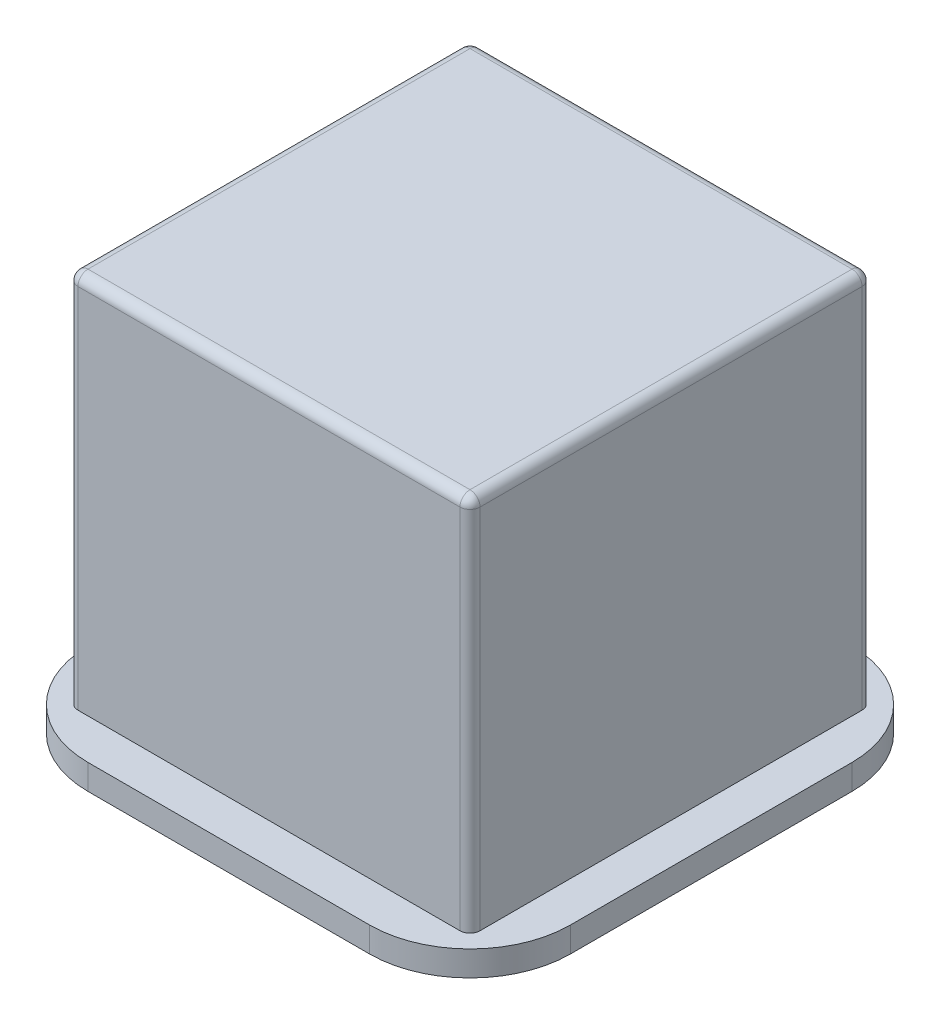
ISO-10303-21;
HEADER;
FILE_DESCRIPTION(('STEP AP214'),'2;1');
FILE_NAME('part.step','',(''),(''),'','','');
FILE_SCHEMA(('AUTOMOTIVE_DESIGN { 1 0 10303 214 1 1 1 1 }'));
ENDSEC;
DATA;
#1=APPLICATION_CONTEXT('core data for automotive mechanical design processes');
#2=APPLICATION_PROTOCOL_DEFINITION('international standard','automotive_design',2000,#1);
#3=PRODUCT_CONTEXT('',#1,'mechanical');
#4=PRODUCT('Part','Part','',(#3));
#5=PRODUCT_RELATED_PRODUCT_CATEGORY('part','',(#4));
#6=PRODUCT_DEFINITION_FORMATION('','',#4);
#7=PRODUCT_DEFINITION_CONTEXT('part definition',#1,'design');
#8=PRODUCT_DEFINITION('design','',#6,#7);
#9=PRODUCT_DEFINITION_SHAPE('','',#8);
#10=(LENGTH_UNIT() NAMED_UNIT(*) SI_UNIT(.MILLI.,.METRE.));
#11=(NAMED_UNIT(*) PLANE_ANGLE_UNIT() SI_UNIT($,.RADIAN.));
#12=(NAMED_UNIT(*) SI_UNIT($,.STERADIAN.) SOLID_ANGLE_UNIT());
#13=UNCERTAINTY_MEASURE_WITH_UNIT(LENGTH_MEASURE(1.E-05),#10,'distance_accuracy_value','');
#14=(GEOMETRIC_REPRESENTATION_CONTEXT(3) GLOBAL_UNCERTAINTY_ASSIGNED_CONTEXT((#13)) GLOBAL_UNIT_ASSIGNED_CONTEXT((#10,
#11,#12)) REPRESENTATION_CONTEXT('',''));
#15=CARTESIAN_POINT('',(0.,0.,0.));
#16=DIRECTION('',(0.,0.,1.));
#17=DIRECTION('',(1.,0.,0.));
#18=AXIS2_PLACEMENT_3D('',#15,#16,#17);
#19=CARTESIAN_POINT('',(0.,200.,0.));
#20=DIRECTION('',(1.,0.,0.));
#21=DIRECTION('',(0.,0.,-1.));
#22=AXIS2_PLACEMENT_3D('',#19,#20,#21);
#23=PLANE('',#22);
#24=DIRECTION('',(0.,0.,1.));
#25=VECTOR('',#24,1.);
#26=CARTESIAN_POINT('',(0.,195.,0.));
#27=LINE('',#26,#25);
#28=CARTESIAN_POINT('',(0.,195.,-5.));
#29=VERTEX_POINT('',#28);
#30=CARTESIAN_POINT('',(0.,195.,-195.));
#31=VERTEX_POINT('',#30);
#32=EDGE_CURVE('E50',#29,#31,#27,.F.);
#33=ORIENTED_EDGE('',*,*,#32,.T.);
#34=DIRECTION('',(0.,-1.,0.));
#35=VECTOR('',#34,1.);
#36=CARTESIAN_POINT('',(0.,200.,-195.));
#37=LINE('',#36,#35);
#38=CARTESIAN_POINT('',(0.,12.5,-195.));
#39=VERTEX_POINT('',#38);
#40=EDGE_CURVE('E260',#31,#39,#37,.T.);
#41=ORIENTED_EDGE('',*,*,#40,.T.);
#42=DIRECTION('',(0.,0.,-1.));
#43=VECTOR('',#42,1.);
#44=CARTESIAN_POINT('',(0.,12.5,-220.));
#45=LINE('',#44,#43);
#46=CARTESIAN_POINT('',(0.,12.5,-5.));
#47=VERTEX_POINT('',#46);
#48=EDGE_CURVE('E202',#47,#39,#45,.T.);
#49=ORIENTED_EDGE('',*,*,#48,.F.);
#50=DIRECTION('',(0.,-1.,0.));
#51=VECTOR('',#50,1.);
#52=CARTESIAN_POINT('',(0.,200.,-5.));
#53=LINE('',#52,#51);
#54=EDGE_CURVE('E55',#47,#29,#53,.F.);
#55=ORIENTED_EDGE('',*,*,#54,.T.);
#56=EDGE_LOOP('',(#33,#41,#49,#55));
#57=FACE_BOUND('',#56,.T.);
#58=ADVANCED_FACE('F33',(#57),#23,.F.);
#59=CARTESIAN_POINT('',(0.,200.,-200.));
#60=DIRECTION('',(0.,0.,1.));
#61=DIRECTION('',(1.,0.,0.));
#62=AXIS2_PLACEMENT_3D('',#59,#60,#61);
#63=PLANE('',#62);
#64=DIRECTION('',(-1.,0.,0.));
#65=VECTOR('',#64,1.);
#66=CARTESIAN_POINT('',(0.,195.,-200.));
#67=LINE('',#66,#65);
#68=CARTESIAN_POINT('',(5.,195.,-200.));
#69=VERTEX_POINT('',#68);
#70=CARTESIAN_POINT('',(195.,195.,-200.));
#71=VERTEX_POINT('',#70);
#72=EDGE_CURVE('E232',#69,#71,#67,.F.);
#73=ORIENTED_EDGE('',*,*,#72,.T.);
#74=DIRECTION('',(0.,-1.,0.));
#75=VECTOR('',#74,1.);
#76=CARTESIAN_POINT('',(195.,200.,-200.));
#77=LINE('',#76,#75);
#78=CARTESIAN_POINT('',(195.,12.5,-200.));
#79=VERTEX_POINT('',#78);
#80=EDGE_CURVE('E234',#71,#79,#77,.T.);
#81=ORIENTED_EDGE('',*,*,#80,.T.);
#82=DIRECTION('',(1.,0.,0.));
#83=VECTOR('',#82,1.);
#84=CARTESIAN_POINT('',(220.,12.5,-200.));
#85=LINE('',#84,#83);
#86=CARTESIAN_POINT('',(5.,12.5,-200.));
#87=VERTEX_POINT('',#86);
#88=EDGE_CURVE('E194',#87,#79,#85,.T.);
#89=ORIENTED_EDGE('',*,*,#88,.F.);
#90=DIRECTION('',(0.,-1.,0.));
#91=VECTOR('',#90,1.);
#92=CARTESIAN_POINT('',(5.,200.,-200.));
#93=LINE('',#92,#91);
#94=EDGE_CURVE('E230',#87,#69,#93,.F.);
#95=ORIENTED_EDGE('',*,*,#94,.T.);
#96=EDGE_LOOP('',(#73,#81,#89,#95));
#97=FACE_BOUND('',#96,.T.);
#98=ADVANCED_FACE('F351',(#97),#63,.F.);
#99=CARTESIAN_POINT('',(200.,200.,0.));
#100=DIRECTION('',(-1.,0.,0.));
#101=DIRECTION('',(0.,0.,1.));
#102=AXIS2_PLACEMENT_3D('',#99,#100,#101);
#103=PLANE('',#102);
#104=DIRECTION('',(0.,0.,1.));
#105=VECTOR('',#104,1.);
#106=CARTESIAN_POINT('',(200.,12.5,20.));
#107=LINE('',#106,#105);
#108=CARTESIAN_POINT('',(200.,12.5,-195.));
#109=VERTEX_POINT('',#108);
#110=CARTESIAN_POINT('',(200.,12.5,-5.));
#111=VERTEX_POINT('',#110);
#112=EDGE_CURVE('E186',#109,#111,#107,.T.);
#113=ORIENTED_EDGE('',*,*,#112,.F.);
#114=DIRECTION('',(0.,-1.,0.));
#115=VECTOR('',#114,1.);
#116=CARTESIAN_POINT('',(200.,200.,-195.));
#117=LINE('',#116,#115);
#118=CARTESIAN_POINT('',(200.,195.,-195.));
#119=VERTEX_POINT('',#118);
#120=EDGE_CURVE('E241',#109,#119,#117,.F.);
#121=ORIENTED_EDGE('',*,*,#120,.T.);
#122=DIRECTION('',(0.,0.,-1.));
#123=VECTOR('',#122,1.);
#124=CARTESIAN_POINT('',(200.,195.,0.));
#125=LINE('',#124,#123);
#126=CARTESIAN_POINT('',(200.,195.,-5.));
#127=VERTEX_POINT('',#126);
#128=EDGE_CURVE('E237',#119,#127,#125,.F.);
#129=ORIENTED_EDGE('',*,*,#128,.T.);
#130=DIRECTION('',(0.,-1.,0.));
#131=VECTOR('',#130,1.);
#132=CARTESIAN_POINT('',(200.,200.,-5.));
#133=LINE('',#132,#131);
#134=EDGE_CURVE('E239',#127,#111,#133,.T.);
#135=ORIENTED_EDGE('',*,*,#134,.T.);
#136=EDGE_LOOP('',(#113,#121,#129,#135));
#137=FACE_BOUND('',#136,.T.);
#138=ADVANCED_FACE('F356',(#137),#103,.F.);
#139=CARTESIAN_POINT('',(0.,200.,0.));
#140=DIRECTION('',(0.,0.,-1.));
#141=DIRECTION('',(-1.,0.,0.));
#142=AXIS2_PLACEMENT_3D('',#139,#140,#141);
#143=PLANE('',#142);
#144=DIRECTION('',(-1.,0.,0.));
#145=VECTOR('',#144,1.);
#146=CARTESIAN_POINT('',(0.,12.5,0.));
#147=LINE('',#146,#145);
#148=CARTESIAN_POINT('',(195.,12.5,0.));
#149=VERTEX_POINT('',#148);
#150=CARTESIAN_POINT('',(5.,12.5,0.));
#151=VERTEX_POINT('',#150);
#152=EDGE_CURVE('E188',#149,#151,#147,.T.);
#153=ORIENTED_EDGE('',*,*,#152,.F.);
#154=DIRECTION('',(0.,-1.,0.));
#155=VECTOR('',#154,1.);
#156=CARTESIAN_POINT('',(195.,200.,0.));
#157=LINE('',#156,#155);
#158=CARTESIAN_POINT('',(195.,195.,0.));
#159=VERTEX_POINT('',#158);
#160=EDGE_CURVE('E247',#149,#159,#157,.F.);
#161=ORIENTED_EDGE('',*,*,#160,.T.);
#162=DIRECTION('',(1.,0.,0.));
#163=VECTOR('',#162,1.);
#164=CARTESIAN_POINT('',(0.,195.,0.));
#165=LINE('',#164,#163);
#166=CARTESIAN_POINT('',(5.,195.,0.));
#167=VERTEX_POINT('',#166);
#168=EDGE_CURVE('E245',#159,#167,#165,.F.);
#169=ORIENTED_EDGE('',*,*,#168,.T.);
#170=DIRECTION('',(0.,-1.,0.));
#171=VECTOR('',#170,1.);
#172=CARTESIAN_POINT('',(5.,200.,0.));
#173=LINE('',#172,#171);
#174=EDGE_CURVE('E243',#167,#151,#173,.T.);
#175=ORIENTED_EDGE('',*,*,#174,.T.);
#176=EDGE_LOOP('',(#153,#161,#169,#175));
#177=FACE_BOUND('',#176,.T.);
#178=ADVANCED_FACE('F360',(#177),#143,.F.);
#179=CARTESIAN_POINT('',(0.,200.,0.));
#180=DIRECTION('',(0.,-1.,0.));
#181=DIRECTION('',(0.,0.,-1.));
#182=AXIS2_PLACEMENT_3D('',#179,#180,#181);
#183=PLANE('',#182);
#184=DIRECTION('',(0.,0.,-1.));
#185=VECTOR('',#184,1.);
#186=CARTESIAN_POINT('',(195.,200.,0.));
#187=LINE('',#186,#185);
#188=CARTESIAN_POINT('',(195.,200.,-5.));
#189=VERTEX_POINT('',#188);
#190=CARTESIAN_POINT('',(195.,200.,-195.));
#191=VERTEX_POINT('',#190);
#192=EDGE_CURVE('E253',#189,#191,#187,.T.);
#193=ORIENTED_EDGE('',*,*,#192,.T.);
#194=DIRECTION('',(-1.,0.,0.));
#195=VECTOR('',#194,1.);
#196=CARTESIAN_POINT('',(0.,200.,-195.));
#197=LINE('',#196,#195);
#198=CARTESIAN_POINT('',(5.,200.,-195.));
#199=VERTEX_POINT('',#198);
#200=EDGE_CURVE('E255',#191,#199,#197,.T.);
#201=ORIENTED_EDGE('',*,*,#200,.T.);
#202=DIRECTION('',(0.,0.,1.));
#203=VECTOR('',#202,1.);
#204=CARTESIAN_POINT('',(5.,200.,0.));
#205=LINE('',#204,#203);
#206=CARTESIAN_POINT('',(5.,200.,-5.));
#207=VERTEX_POINT('',#206);
#208=EDGE_CURVE('E251',#199,#207,#205,.T.);
#209=ORIENTED_EDGE('',*,*,#208,.T.);
#210=DIRECTION('',(1.,0.,0.));
#211=VECTOR('',#210,1.);
#212=CARTESIAN_POINT('',(0.,200.,-5.));
#213=LINE('',#212,#211);
#214=EDGE_CURVE('E249',#207,#189,#213,.T.);
#215=ORIENTED_EDGE('',*,*,#214,.T.);
#216=EDGE_LOOP('',(#193,#201,#209,#215));
#217=FACE_BOUND('',#216,.T.);
#218=ADVANCED_FACE('F438',(#217),#183,.F.);
#219=CARTESIAN_POINT('',(0.,0.,0.));
#220=DIRECTION('',(0.,-1.,0.));
#221=DIRECTION('',(0.,0.,-1.));
#222=AXIS2_PLACEMENT_3D('',#219,#220,#221);
#223=PLANE('',#222);
#224=DIRECTION('',(0.,0.,-1.));
#225=VECTOR('',#224,1.);
#226=CARTESIAN_POINT('',(220.,0.,20.));
#227=LINE('',#226,#225);
#228=CARTESIAN_POINT('',(220.,0.,-30.));
#229=VERTEX_POINT('',#228);
#230=CARTESIAN_POINT('',(220.,0.,-170.));
#231=VERTEX_POINT('',#230);
#232=EDGE_CURVE('E176',#229,#231,#227,.T.);
#233=ORIENTED_EDGE('',*,*,#232,.F.);
#234=CARTESIAN_POINT('',(170.,0.,-30.));
#235=DIRECTION('',(0.,-1.,0.));
#236=DIRECTION('',(0.,0.,-1.));
#237=AXIS2_PLACEMENT_3D('',#234,#235,#236);
#238=CIRCLE('',#237,50.);
#239=CARTESIAN_POINT('',(170.,0.,20.));
#240=VERTEX_POINT('',#239);
#241=EDGE_CURVE('E159',#229,#240,#238,.T.);
#242=ORIENTED_EDGE('',*,*,#241,.T.);
#243=DIRECTION('',(1.,0.,0.));
#244=VECTOR('',#243,1.);
#245=CARTESIAN_POINT('',(0.,0.,20.));
#246=LINE('',#245,#244);
#247=CARTESIAN_POINT('',(30.,0.,20.));
#248=VERTEX_POINT('',#247);
#249=EDGE_CURVE('E197',#248,#240,#246,.T.);
#250=ORIENTED_EDGE('',*,*,#249,.F.);
#251=CARTESIAN_POINT('',(30.,0.,-30.));
#252=DIRECTION('',(0.,-1.,0.));
#253=DIRECTION('',(0.,0.,-1.));
#254=AXIS2_PLACEMENT_3D('',#251,#252,#253);
#255=CIRCLE('',#254,50.);
#256=CARTESIAN_POINT('',(-20.,0.,-30.));
#257=VERTEX_POINT('',#256);
#258=EDGE_CURVE('E170',#248,#257,#255,.T.);
#259=ORIENTED_EDGE('',*,*,#258,.T.);
#260=DIRECTION('',(0.,0.,1.));
#261=VECTOR('',#260,1.);
#262=CARTESIAN_POINT('',(-20.,0.,-220.));
#263=LINE('',#262,#261);
#264=CARTESIAN_POINT('',(-20.,0.,-170.));
#265=VERTEX_POINT('',#264);
#266=EDGE_CURVE('E302',#265,#257,#263,.T.);
#267=ORIENTED_EDGE('',*,*,#266,.F.);
#268=CARTESIAN_POINT('',(30.,0.,-170.));
#269=DIRECTION('',(0.,-1.,0.));
#270=DIRECTION('',(0.,0.,-1.));
#271=AXIS2_PLACEMENT_3D('',#268,#269,#270);
#272=CIRCLE('',#271,50.);
#273=CARTESIAN_POINT('',(30.,0.,-220.));
#274=VERTEX_POINT('',#273);
#275=EDGE_CURVE('E180',#265,#274,#272,.T.);
#276=ORIENTED_EDGE('',*,*,#275,.T.);
#277=DIRECTION('',(-1.,0.,0.));
#278=VECTOR('',#277,1.);
#279=CARTESIAN_POINT('',(220.,0.,-220.));
#280=LINE('',#279,#278);
#281=CARTESIAN_POINT('',(170.,0.,-220.));
#282=VERTEX_POINT('',#281);
#283=EDGE_CURVE('E316',#282,#274,#280,.T.);
#284=ORIENTED_EDGE('',*,*,#283,.F.);
#285=CARTESIAN_POINT('',(170.,0.,-170.));
#286=DIRECTION('',(0.,-1.,0.));
#287=DIRECTION('',(0.,0.,-1.));
#288=AXIS2_PLACEMENT_3D('',#285,#286,#287);
#289=CIRCLE('',#288,50.);
#290=EDGE_CURVE('E185',#282,#231,#289,.T.);
#291=ORIENTED_EDGE('',*,*,#290,.T.);
#292=EDGE_LOOP('',(#233,#242,#250,#259,#267,#276,#284,#291));
#293=FACE_BOUND('',#292,.T.);
#294=ADVANCED_FACE('F183',(#293),#223,.T.);
#295=CARTESIAN_POINT('',(0.,12.5,20.));
#296=DIRECTION('',(0.,-1.,0.));
#297=DIRECTION('',(0.,0.,-1.));
#298=AXIS2_PLACEMENT_3D('',#295,#296,#297);
#299=PLANE('',#298);
#300=ORIENTED_EDGE('',*,*,#112,.T.);
#301=CARTESIAN_POINT('',(195.,12.5,-5.));
#302=DIRECTION('',(0.,-1.,0.));
#303=DIRECTION('',(0.,0.,-1.));
#304=AXIS2_PLACEMENT_3D('',#301,#302,#303);
#305=CIRCLE('',#304,5.);
#306=EDGE_CURVE('E264',#111,#149,#305,.T.);
#307=ORIENTED_EDGE('',*,*,#306,.T.);
#308=ORIENTED_EDGE('',*,*,#152,.T.);
#309=CARTESIAN_POINT('',(5.,12.5,-5.));
#310=DIRECTION('',(0.,-1.,0.));
#311=DIRECTION('',(0.,0.,-1.));
#312=AXIS2_PLACEMENT_3D('',#309,#310,#311);
#313=CIRCLE('',#312,5.);
#314=EDGE_CURVE('E11',#151,#47,#313,.T.);
#315=ORIENTED_EDGE('',*,*,#314,.T.);
#316=ORIENTED_EDGE('',*,*,#48,.T.);
#317=CARTESIAN_POINT('',(5.,12.5,-195.));
#318=DIRECTION('',(0.,-1.,0.));
#319=DIRECTION('',(0.,0.,-1.));
#320=AXIS2_PLACEMENT_3D('',#317,#318,#319);
#321=CIRCLE('',#320,5.);
#322=EDGE_CURVE('E42',#39,#87,#321,.T.);
#323=ORIENTED_EDGE('',*,*,#322,.T.);
#324=ORIENTED_EDGE('',*,*,#88,.T.);
#325=CARTESIAN_POINT('',(195.,12.5,-195.));
#326=DIRECTION('',(0.,-1.,0.));
#327=DIRECTION('',(0.,0.,-1.));
#328=AXIS2_PLACEMENT_3D('',#325,#326,#327);
#329=CIRCLE('',#328,5.);
#330=EDGE_CURVE('E262',#79,#109,#329,.T.);
#331=ORIENTED_EDGE('',*,*,#330,.T.);
#332=EDGE_LOOP('',(#300,#307,#308,#315,#316,#323,#324,#331));
#333=FACE_BOUND('',#332,.T.);
#334=DIRECTION('',(-1.,0.,0.));
#335=VECTOR('',#334,1.);
#336=CARTESIAN_POINT('',(0.,12.5,20.));
#337=LINE('',#336,#335);
#338=CARTESIAN_POINT('',(170.,12.5,20.));
#339=VERTEX_POINT('',#338);
#340=CARTESIAN_POINT('',(30.,12.5,20.));
#341=VERTEX_POINT('',#340);
#342=EDGE_CURVE('E199',#339,#341,#337,.T.);
#343=ORIENTED_EDGE('',*,*,#342,.F.);
#344=CARTESIAN_POINT('',(170.,12.5,-30.));
#345=DIRECTION('',(0.,-1.,0.));
#346=DIRECTION('',(0.,0.,-1.));
#347=AXIS2_PLACEMENT_3D('',#344,#345,#346);
#348=CIRCLE('',#347,50.);
#349=CARTESIAN_POINT('',(220.,12.5,-30.));
#350=VERTEX_POINT('',#349);
#351=EDGE_CURVE('E217',#339,#350,#348,.F.);
#352=ORIENTED_EDGE('',*,*,#351,.T.);
#353=DIRECTION('',(0.,0.,1.));
#354=VECTOR('',#353,1.);
#355=CARTESIAN_POINT('',(220.,12.5,20.));
#356=LINE('',#355,#354);
#357=CARTESIAN_POINT('',(220.,12.5,-170.));
#358=VERTEX_POINT('',#357);
#359=EDGE_CURVE('E179',#358,#350,#356,.T.);
#360=ORIENTED_EDGE('',*,*,#359,.F.);
#361=CARTESIAN_POINT('',(170.,12.5,-170.));
#362=DIRECTION('',(0.,-1.,0.));
#363=DIRECTION('',(0.,0.,-1.));
#364=AXIS2_PLACEMENT_3D('',#361,#362,#363);
#365=CIRCLE('',#364,50.);
#366=CARTESIAN_POINT('',(170.,12.5,-220.));
#367=VERTEX_POINT('',#366);
#368=EDGE_CURVE('E213',#358,#367,#365,.F.);
#369=ORIENTED_EDGE('',*,*,#368,.T.);
#370=DIRECTION('',(1.,0.,0.));
#371=VECTOR('',#370,1.);
#372=CARTESIAN_POINT('',(220.,12.5,-220.));
#373=LINE('',#372,#371);
#374=CARTESIAN_POINT('',(30.,12.5,-220.));
#375=VERTEX_POINT('',#374);
#376=EDGE_CURVE('E191',#375,#367,#373,.T.);
#377=ORIENTED_EDGE('',*,*,#376,.F.);
#378=CARTESIAN_POINT('',(30.,12.5,-170.));
#379=DIRECTION('',(0.,-1.,0.));
#380=DIRECTION('',(0.,0.,-1.));
#381=AXIS2_PLACEMENT_3D('',#378,#379,#380);
#382=CIRCLE('',#381,50.);
#383=CARTESIAN_POINT('',(-20.,12.5,-170.));
#384=VERTEX_POINT('',#383);
#385=EDGE_CURVE('E211',#375,#384,#382,.F.);
#386=ORIENTED_EDGE('',*,*,#385,.T.);
#387=DIRECTION('',(0.,0.,-1.));
#388=VECTOR('',#387,1.);
#389=CARTESIAN_POINT('',(-20.,12.5,-220.));
#390=LINE('',#389,#388);
#391=CARTESIAN_POINT('',(-20.,12.5,-30.));
#392=VERTEX_POINT('',#391);
#393=EDGE_CURVE('E306',#392,#384,#390,.T.);
#394=ORIENTED_EDGE('',*,*,#393,.F.);
#395=CARTESIAN_POINT('',(30.,12.5,-30.));
#396=DIRECTION('',(0.,-1.,0.));
#397=DIRECTION('',(0.,0.,-1.));
#398=AXIS2_PLACEMENT_3D('',#395,#396,#397);
#399=CIRCLE('',#398,50.);
#400=EDGE_CURVE('E215',#392,#341,#399,.F.);
#401=ORIENTED_EDGE('',*,*,#400,.T.);
#402=EDGE_LOOP('',(#343,#352,#360,#369,#377,#386,#394,#401));
#403=FACE_BOUND('',#402,.T.);
#404=ADVANCED_FACE('F330',(#333,#403),#299,.F.);
#405=CARTESIAN_POINT('',(0.,0.,20.));
#406=DIRECTION('',(0.,0.,-1.));
#407=DIRECTION('',(-1.,0.,0.));
#408=AXIS2_PLACEMENT_3D('',#405,#406,#407);
#409=PLANE('',#408);
#410=ORIENTED_EDGE('',*,*,#249,.T.);
#411=DIRECTION('',(0.,-1.,0.));
#412=VECTOR('',#411,1.);
#413=CARTESIAN_POINT('',(170.,12.5,20.));
#414=LINE('',#413,#412);
#415=EDGE_CURVE('E164',#240,#339,#414,.F.);
#416=ORIENTED_EDGE('',*,*,#415,.T.);
#417=ORIENTED_EDGE('',*,*,#342,.T.);
#418=DIRECTION('',(0.,1.,0.));
#419=VECTOR('',#418,1.);
#420=CARTESIAN_POINT('',(30.,0.,20.));
#421=LINE('',#420,#419);
#422=EDGE_CURVE('E169',#341,#248,#421,.F.);
#423=ORIENTED_EDGE('',*,*,#422,.T.);
#424=EDGE_LOOP('',(#410,#416,#417,#423));
#425=FACE_BOUND('',#424,.T.);
#426=ADVANCED_FACE('F334',(#425),#409,.F.);
#427=CARTESIAN_POINT('',(220.,0.,0.));
#428=DIRECTION('',(1.,0.,0.));
#429=DIRECTION('',(0.,0.,-1.));
#430=AXIS2_PLACEMENT_3D('',#427,#428,#429);
#431=PLANE('',#430);
#432=ORIENTED_EDGE('',*,*,#359,.T.);
#433=DIRECTION('',(0.,-1.,0.));
#434=VECTOR('',#433,1.);
#435=CARTESIAN_POINT('',(220.,0.,-30.));
#436=LINE('',#435,#434);
#437=EDGE_CURVE('E163',#350,#229,#436,.T.);
#438=ORIENTED_EDGE('',*,*,#437,.T.);
#439=ORIENTED_EDGE('',*,*,#232,.T.);
#440=DIRECTION('',(0.,-1.,0.));
#441=VECTOR('',#440,1.);
#442=CARTESIAN_POINT('',(220.,0.,-170.));
#443=LINE('',#442,#441);
#444=EDGE_CURVE('E181',#231,#358,#443,.F.);
#445=ORIENTED_EDGE('',*,*,#444,.T.);
#446=EDGE_LOOP('',(#432,#438,#439,#445));
#447=FACE_BOUND('',#446,.T.);
#448=ADVANCED_FACE('F175',(#447),#431,.T.);
#449=CARTESIAN_POINT('',(0.,0.,-220.));
#450=DIRECTION('',(0.,0.,-1.));
#451=DIRECTION('',(-1.,0.,0.));
#452=AXIS2_PLACEMENT_3D('',#449,#450,#451);
#453=PLANE('',#452);
#454=ORIENTED_EDGE('',*,*,#376,.T.);
#455=DIRECTION('',(0.,-1.,0.));
#456=VECTOR('',#455,1.);
#457=CARTESIAN_POINT('',(170.,0.,-220.));
#458=LINE('',#457,#456);
#459=EDGE_CURVE('E227',#367,#282,#458,.T.);
#460=ORIENTED_EDGE('',*,*,#459,.T.);
#461=ORIENTED_EDGE('',*,*,#283,.T.);
#462=DIRECTION('',(0.,-1.,0.));
#463=VECTOR('',#462,1.);
#464=CARTESIAN_POINT('',(30.,0.,-220.));
#465=LINE('',#464,#463);
#466=EDGE_CURVE('E225',#274,#375,#465,.F.);
#467=ORIENTED_EDGE('',*,*,#466,.T.);
#468=EDGE_LOOP('',(#454,#460,#461,#467));
#469=FACE_BOUND('',#468,.T.);
#470=ADVANCED_FACE('F322',(#469),#453,.T.);
#471=CARTESIAN_POINT('',(-20.,0.,0.));
#472=DIRECTION('',(-1.,0.,0.));
#473=DIRECTION('',(0.,0.,1.));
#474=AXIS2_PLACEMENT_3D('',#471,#472,#473);
#475=PLANE('',#474);
#476=ORIENTED_EDGE('',*,*,#266,.T.);
#477=DIRECTION('',(0.,1.,0.));
#478=VECTOR('',#477,1.);
#479=CARTESIAN_POINT('',(-20.,12.5,-30.));
#480=LINE('',#479,#478);
#481=EDGE_CURVE('E222',#257,#392,#480,.T.);
#482=ORIENTED_EDGE('',*,*,#481,.T.);
#483=ORIENTED_EDGE('',*,*,#393,.T.);
#484=DIRECTION('',(0.,-1.,0.));
#485=VECTOR('',#484,1.);
#486=CARTESIAN_POINT('',(-20.,0.,-170.));
#487=LINE('',#486,#485);
#488=EDGE_CURVE('E219',#384,#265,#487,.T.);
#489=ORIENTED_EDGE('',*,*,#488,.T.);
#490=EDGE_LOOP('',(#476,#482,#483,#489));
#491=FACE_BOUND('',#490,.T.);
#492=ADVANCED_FACE('F341',(#491),#475,.T.);
#493=CARTESIAN_POINT('',(170.,0.,-30.));
#494=DIRECTION('',(0.,1.,0.));
#495=DIRECTION('',(0.,0.,1.));
#496=AXIS2_PLACEMENT_3D('',#493,#494,#495);
#497=CYLINDRICAL_SURFACE('',#496,50.);
#498=ORIENTED_EDGE('',*,*,#351,.F.);
#499=ORIENTED_EDGE('',*,*,#415,.F.);
#500=ORIENTED_EDGE('',*,*,#241,.F.);
#501=ORIENTED_EDGE('',*,*,#437,.F.);
#502=EDGE_LOOP('',(#498,#499,#500,#501));
#503=FACE_BOUND('',#502,.T.);
#504=ADVANCED_FACE('F162',(#503),#497,.T.);
#505=CARTESIAN_POINT('',(30.,0.,-30.));
#506=DIRECTION('',(0.,-1.,0.));
#507=DIRECTION('',(0.,0.,-1.));
#508=AXIS2_PLACEMENT_3D('',#505,#506,#507);
#509=CYLINDRICAL_SURFACE('',#508,50.);
#510=ORIENTED_EDGE('',*,*,#258,.F.);
#511=ORIENTED_EDGE('',*,*,#422,.F.);
#512=ORIENTED_EDGE('',*,*,#400,.F.);
#513=ORIENTED_EDGE('',*,*,#481,.F.);
#514=EDGE_LOOP('',(#510,#511,#512,#513));
#515=FACE_BOUND('',#514,.T.);
#516=ADVANCED_FACE('F337',(#515),#509,.T.);
#517=CARTESIAN_POINT('',(170.,0.,-170.));
#518=DIRECTION('',(0.,-1.,0.));
#519=DIRECTION('',(0.,0.,-1.));
#520=AXIS2_PLACEMENT_3D('',#517,#518,#519);
#521=CYLINDRICAL_SURFACE('',#520,50.);
#522=ORIENTED_EDGE('',*,*,#368,.F.);
#523=ORIENTED_EDGE('',*,*,#444,.F.);
#524=ORIENTED_EDGE('',*,*,#290,.F.);
#525=ORIENTED_EDGE('',*,*,#459,.F.);
#526=EDGE_LOOP('',(#522,#523,#524,#525));
#527=FACE_BOUND('',#526,.T.);
#528=ADVANCED_FACE('F328',(#527),#521,.T.);
#529=CARTESIAN_POINT('',(30.,0.,-170.));
#530=DIRECTION('',(0.,-1.,0.));
#531=DIRECTION('',(0.,0.,-1.));
#532=AXIS2_PLACEMENT_3D('',#529,#530,#531);
#533=CYLINDRICAL_SURFACE('',#532,50.);
#534=ORIENTED_EDGE('',*,*,#385,.F.);
#535=ORIENTED_EDGE('',*,*,#466,.F.);
#536=ORIENTED_EDGE('',*,*,#275,.F.);
#537=ORIENTED_EDGE('',*,*,#488,.F.);
#538=EDGE_LOOP('',(#534,#535,#536,#537));
#539=FACE_BOUND('',#538,.T.);
#540=ADVANCED_FACE('F340',(#539),#533,.T.);
#541=CARTESIAN_POINT('',(5.,200.,-5.));
#542=DIRECTION('',(0.,-1.,0.));
#543=DIRECTION('',(0.,0.,-1.));
#544=AXIS2_PLACEMENT_3D('',#541,#542,#543);
#545=CYLINDRICAL_SURFACE('',#544,5.);
#546=CARTESIAN_POINT('',(5.,195.,-5.));
#547=DIRECTION('',(0.,1.,0.));
#548=DIRECTION('',(0.,0.,1.));
#549=AXIS2_PLACEMENT_3D('',#546,#547,#548);
#550=CIRCLE('',#549,5.);
#551=EDGE_CURVE('E37',#29,#167,#550,.T.);
#552=ORIENTED_EDGE('',*,*,#551,.F.);
#553=ORIENTED_EDGE('',*,*,#54,.F.);
#554=ORIENTED_EDGE('',*,*,#314,.F.);
#555=ORIENTED_EDGE('',*,*,#174,.F.);
#556=EDGE_LOOP('',(#552,#553,#554,#555));
#557=FACE_BOUND('',#556,.T.);
#558=ADVANCED_FACE('F35',(#557),#545,.T.);
#559=CARTESIAN_POINT('',(5.,195.,-5.));
#560=DIRECTION('',(0.,0.,1.));
#561=DIRECTION('',(1.,0.,0.));
#562=AXIS2_PLACEMENT_3D('',#559,#560,#561);
#563=SPHERICAL_SURFACE('',#562,5.);
#564=CARTESIAN_POINT('',(5.,195.,-5.));
#565=DIRECTION('',(0.,0.,1.));
#566=DIRECTION('',(1.,0.,0.));
#567=AXIS2_PLACEMENT_3D('',#564,#565,#566);
#568=CIRCLE('',#567,5.);
#569=EDGE_CURVE('E293',#29,#207,#568,.F.);
#570=ORIENTED_EDGE('',*,*,#569,.F.);
#571=ORIENTED_EDGE('',*,*,#551,.T.);
#572=CARTESIAN_POINT('',(5.,195.,-5.));
#573=DIRECTION('',(-1.,0.,0.));
#574=DIRECTION('',(0.,0.,1.));
#575=AXIS2_PLACEMENT_3D('',#572,#573,#574);
#576=CIRCLE('',#575,5.);
#577=EDGE_CURVE('E295',#207,#167,#576,.F.);
#578=ORIENTED_EDGE('',*,*,#577,.F.);
#579=EDGE_LOOP('',(#570,#571,#578));
#580=FACE_BOUND('',#579,.T.);
#581=ADVANCED_FACE('F406',(#580),#563,.T.);
#582=CARTESIAN_POINT('',(195.,200.,-5.));
#583=DIRECTION('',(0.,-1.,0.));
#584=DIRECTION('',(0.,0.,-1.));
#585=AXIS2_PLACEMENT_3D('',#582,#583,#584);
#586=CYLINDRICAL_SURFACE('',#585,5.);
#587=ORIENTED_EDGE('',*,*,#306,.F.);
#588=ORIENTED_EDGE('',*,*,#134,.F.);
#589=CARTESIAN_POINT('',(195.,195.,-5.));
#590=DIRECTION('',(0.,1.,0.));
#591=DIRECTION('',(0.,0.,1.));
#592=AXIS2_PLACEMENT_3D('',#589,#590,#591);
#593=CIRCLE('',#592,5.);
#594=EDGE_CURVE('E290',#159,#127,#593,.T.);
#595=ORIENTED_EDGE('',*,*,#594,.F.);
#596=ORIENTED_EDGE('',*,*,#160,.F.);
#597=EDGE_LOOP('',(#587,#588,#595,#596));
#598=FACE_BOUND('',#597,.T.);
#599=ADVANCED_FACE('F404',(#598),#586,.T.);
#600=CARTESIAN_POINT('',(0.,195.,-5.));
#601=DIRECTION('',(1.,0.,0.));
#602=DIRECTION('',(0.,0.,-1.));
#603=AXIS2_PLACEMENT_3D('',#600,#601,#602);
#604=CYLINDRICAL_SURFACE('',#603,5.);
#605=ORIENTED_EDGE('',*,*,#577,.T.);
#606=ORIENTED_EDGE('',*,*,#168,.F.);
#607=CARTESIAN_POINT('',(195.,195.,-5.));
#608=DIRECTION('',(1.,0.,0.));
#609=DIRECTION('',(0.,0.,-1.));
#610=AXIS2_PLACEMENT_3D('',#607,#608,#609);
#611=CIRCLE('',#610,5.);
#612=EDGE_CURVE('E287',#189,#159,#611,.T.);
#613=ORIENTED_EDGE('',*,*,#612,.F.);
#614=ORIENTED_EDGE('',*,*,#214,.F.);
#615=EDGE_LOOP('',(#605,#606,#613,#614));
#616=FACE_BOUND('',#615,.T.);
#617=ADVANCED_FACE('F400',(#616),#604,.T.);
#618=CARTESIAN_POINT('',(5.,195.,0.));
#619=DIRECTION('',(0.,0.,1.));
#620=DIRECTION('',(1.,0.,0.));
#621=AXIS2_PLACEMENT_3D('',#618,#619,#620);
#622=CYLINDRICAL_SURFACE('',#621,5.);
#623=ORIENTED_EDGE('',*,*,#569,.T.);
#624=ORIENTED_EDGE('',*,*,#208,.F.);
#625=CARTESIAN_POINT('',(5.,195.,-195.));
#626=DIRECTION('',(0.,0.,-1.));
#627=DIRECTION('',(-1.,0.,0.));
#628=AXIS2_PLACEMENT_3D('',#625,#626,#627);
#629=CIRCLE('',#628,5.);
#630=EDGE_CURVE('E284',#31,#199,#629,.T.);
#631=ORIENTED_EDGE('',*,*,#630,.F.);
#632=ORIENTED_EDGE('',*,*,#32,.F.);
#633=EDGE_LOOP('',(#623,#624,#631,#632));
#634=FACE_BOUND('',#633,.T.);
#635=ADVANCED_FACE('F396',(#634),#622,.T.);
#636=CARTESIAN_POINT('',(5.,200.,-195.));
#637=DIRECTION('',(0.,-1.,0.));
#638=DIRECTION('',(0.,0.,-1.));
#639=AXIS2_PLACEMENT_3D('',#636,#637,#638);
#640=CYLINDRICAL_SURFACE('',#639,5.);
#641=ORIENTED_EDGE('',*,*,#322,.F.);
#642=ORIENTED_EDGE('',*,*,#40,.F.);
#643=CARTESIAN_POINT('',(5.,195.,-195.));
#644=DIRECTION('',(0.,1.,0.));
#645=DIRECTION('',(0.,0.,1.));
#646=AXIS2_PLACEMENT_3D('',#643,#644,#645);
#647=CIRCLE('',#646,5.);
#648=EDGE_CURVE('E281',#69,#31,#647,.T.);
#649=ORIENTED_EDGE('',*,*,#648,.F.);
#650=ORIENTED_EDGE('',*,*,#94,.F.);
#651=EDGE_LOOP('',(#641,#642,#649,#650));
#652=FACE_BOUND('',#651,.T.);
#653=ADVANCED_FACE('F392',(#652),#640,.T.);
#654=CARTESIAN_POINT('',(195.,195.,-5.));
#655=DIRECTION('',(0.,0.,1.));
#656=DIRECTION('',(1.,0.,0.));
#657=AXIS2_PLACEMENT_3D('',#654,#655,#656);
#658=SPHERICAL_SURFACE('',#657,5.);
#659=ORIENTED_EDGE('',*,*,#612,.T.);
#660=ORIENTED_EDGE('',*,*,#594,.T.);
#661=CARTESIAN_POINT('',(195.,195.,-5.));
#662=DIRECTION('',(0.,0.,1.));
#663=DIRECTION('',(1.,0.,0.));
#664=AXIS2_PLACEMENT_3D('',#661,#662,#663);
#665=CIRCLE('',#664,5.);
#666=EDGE_CURVE('E278',#189,#127,#665,.F.);
#667=ORIENTED_EDGE('',*,*,#666,.F.);
#668=EDGE_LOOP('',(#659,#660,#667));
#669=FACE_BOUND('',#668,.T.);
#670=ADVANCED_FACE('F388',(#669),#658,.T.);
#671=CARTESIAN_POINT('',(5.,195.,-195.));
#672=DIRECTION('',(0.,0.,1.));
#673=DIRECTION('',(1.,0.,0.));
#674=AXIS2_PLACEMENT_3D('',#671,#672,#673);
#675=SPHERICAL_SURFACE('',#674,5.);
#676=ORIENTED_EDGE('',*,*,#648,.T.);
#677=ORIENTED_EDGE('',*,*,#630,.T.);
#678=CARTESIAN_POINT('',(5.,195.,-195.));
#679=DIRECTION('',(-1.,0.,0.));
#680=DIRECTION('',(0.,0.,1.));
#681=AXIS2_PLACEMENT_3D('',#678,#679,#680);
#682=CIRCLE('',#681,5.);
#683=EDGE_CURVE('E276',#69,#199,#682,.F.);
#684=ORIENTED_EDGE('',*,*,#683,.F.);
#685=EDGE_LOOP('',(#676,#677,#684));
#686=FACE_BOUND('',#685,.T.);
#687=ADVANCED_FACE('F384',(#686),#675,.T.);
#688=CARTESIAN_POINT('',(195.,195.,0.));
#689=DIRECTION('',(0.,0.,-1.));
#690=DIRECTION('',(-1.,0.,0.));
#691=AXIS2_PLACEMENT_3D('',#688,#689,#690);
#692=CYLINDRICAL_SURFACE('',#691,5.);
#693=ORIENTED_EDGE('',*,*,#666,.T.);
#694=ORIENTED_EDGE('',*,*,#128,.F.);
#695=CARTESIAN_POINT('',(195.,195.,-195.));
#696=DIRECTION('',(0.,0.,-1.));
#697=DIRECTION('',(-1.,0.,0.));
#698=AXIS2_PLACEMENT_3D('',#695,#696,#697);
#699=CIRCLE('',#698,5.);
#700=EDGE_CURVE('E273',#191,#119,#699,.T.);
#701=ORIENTED_EDGE('',*,*,#700,.F.);
#702=ORIENTED_EDGE('',*,*,#192,.F.);
#703=EDGE_LOOP('',(#693,#694,#701,#702));
#704=FACE_BOUND('',#703,.T.);
#705=ADVANCED_FACE('F380',(#704),#692,.T.);
#706=CARTESIAN_POINT('',(0.,195.,-195.));
#707=DIRECTION('',(-1.,0.,0.));
#708=DIRECTION('',(0.,0.,1.));
#709=AXIS2_PLACEMENT_3D('',#706,#707,#708);
#710=CYLINDRICAL_SURFACE('',#709,5.);
#711=ORIENTED_EDGE('',*,*,#683,.T.);
#712=ORIENTED_EDGE('',*,*,#200,.F.);
#713=CARTESIAN_POINT('',(195.,195.,-195.));
#714=DIRECTION('',(1.,0.,0.));
#715=DIRECTION('',(0.,0.,-1.));
#716=AXIS2_PLACEMENT_3D('',#713,#714,#715);
#717=CIRCLE('',#716,5.);
#718=EDGE_CURVE('E270',#71,#191,#717,.T.);
#719=ORIENTED_EDGE('',*,*,#718,.F.);
#720=ORIENTED_EDGE('',*,*,#72,.F.);
#721=EDGE_LOOP('',(#711,#712,#719,#720));
#722=FACE_BOUND('',#721,.T.);
#723=ADVANCED_FACE('F376',(#722),#710,.T.);
#724=CARTESIAN_POINT('',(195.,195.,-195.));
#725=DIRECTION('',(0.,0.,1.));
#726=DIRECTION('',(1.,0.,0.));
#727=AXIS2_PLACEMENT_3D('',#724,#725,#726);
#728=SPHERICAL_SURFACE('',#727,5.);
#729=ORIENTED_EDGE('',*,*,#718,.T.);
#730=ORIENTED_EDGE('',*,*,#700,.T.);
#731=CARTESIAN_POINT('',(195.,195.,-195.));
#732=DIRECTION('',(0.,1.,0.));
#733=DIRECTION('',(0.,0.,1.));
#734=AXIS2_PLACEMENT_3D('',#731,#732,#733);
#735=CIRCLE('',#734,5.);
#736=EDGE_CURVE('E267',#71,#119,#735,.F.);
#737=ORIENTED_EDGE('',*,*,#736,.F.);
#738=EDGE_LOOP('',(#729,#730,#737));
#739=FACE_BOUND('',#738,.T.);
#740=ADVANCED_FACE('F372',(#739),#728,.T.);
#741=CARTESIAN_POINT('',(195.,200.,-195.));
#742=DIRECTION('',(0.,-1.,0.));
#743=DIRECTION('',(0.,0.,-1.));
#744=AXIS2_PLACEMENT_3D('',#741,#742,#743);
#745=CYLINDRICAL_SURFACE('',#744,5.);
#746=ORIENTED_EDGE('',*,*,#736,.T.);
#747=ORIENTED_EDGE('',*,*,#120,.F.);
#748=ORIENTED_EDGE('',*,*,#330,.F.);
#749=ORIENTED_EDGE('',*,*,#80,.F.);
#750=EDGE_LOOP('',(#746,#747,#748,#749));
#751=FACE_BOUND('',#750,.T.);
#752=ADVANCED_FACE('F369',(#751),#745,.T.);
#753=CLOSED_SHELL('',(#58,#98,#138,#178,#218,#294,#404,#426,#448,#470,#492,#504,#516,#528,#540,
#558,#581,#599,#617,#635,#653,#670,#687,#705,#723,#740,#752));
#754=MANIFOLD_SOLID_BREP('B2',#753);
#755=ADVANCED_BREP_SHAPE_REPRESENTATION('',(#18,#754),#14);
#756=SHAPE_DEFINITION_REPRESENTATION(#9,#755);
ENDSEC;
END-ISO-10303-21;
